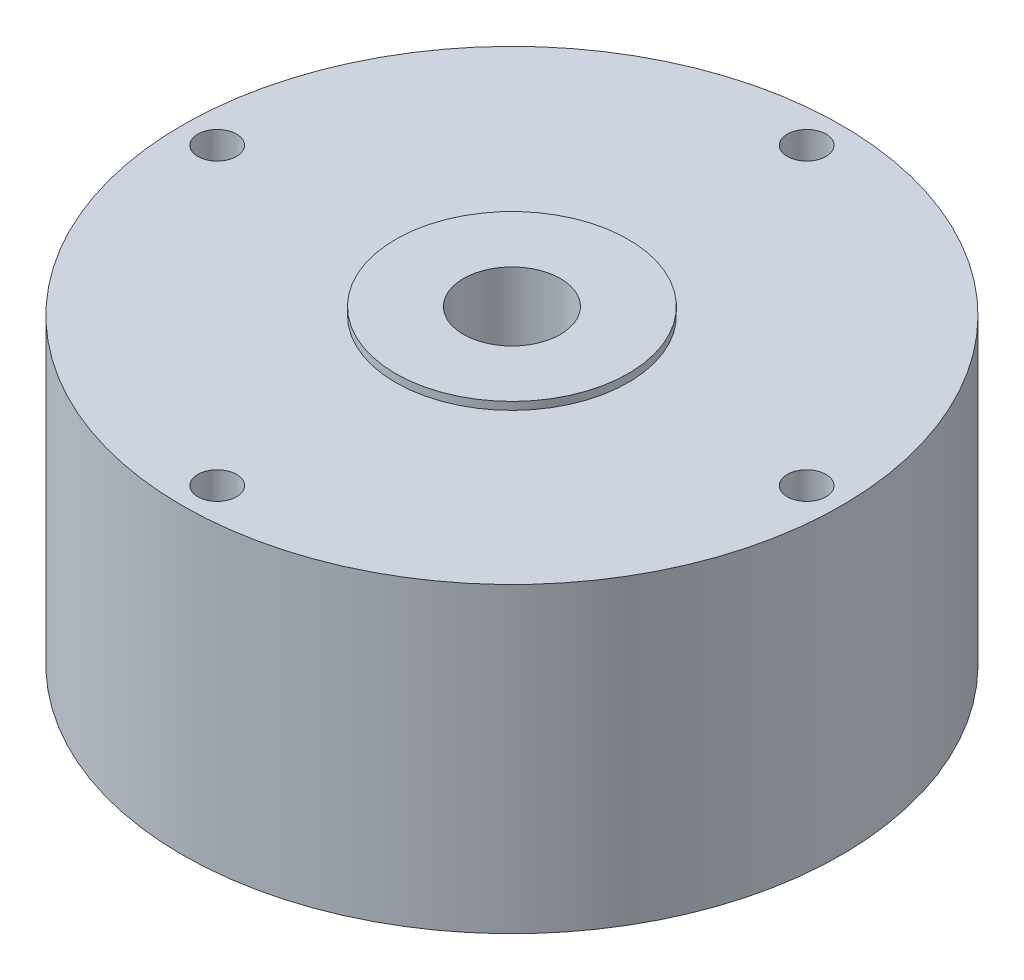
ISO-10303-21;
HEADER;
FILE_DESCRIPTION(('STEP AP214'),'2;1');
FILE_NAME('part.step','',(''),(''),'','','');
FILE_SCHEMA(('AUTOMOTIVE_DESIGN { 1 0 10303 214 1 1 1 1 }'));
ENDSEC;
DATA;
#1=APPLICATION_CONTEXT('core data for automotive mechanical design processes');
#2=APPLICATION_PROTOCOL_DEFINITION('international standard','automotive_design',2000,#1);
#3=PRODUCT_CONTEXT('',#1,'mechanical');
#4=PRODUCT('Part','Part','',(#3));
#5=PRODUCT_RELATED_PRODUCT_CATEGORY('part','',(#4));
#6=PRODUCT_DEFINITION_FORMATION('','',#4);
#7=PRODUCT_DEFINITION_CONTEXT('part definition',#1,'design');
#8=PRODUCT_DEFINITION('design','',#6,#7);
#9=PRODUCT_DEFINITION_SHAPE('','',#8);
#10=(LENGTH_UNIT() NAMED_UNIT(*) SI_UNIT(.MILLI.,.METRE.));
#11=(NAMED_UNIT(*) PLANE_ANGLE_UNIT() SI_UNIT($,.RADIAN.));
#12=(NAMED_UNIT(*) SI_UNIT($,.STERADIAN.) SOLID_ANGLE_UNIT());
#13=UNCERTAINTY_MEASURE_WITH_UNIT(LENGTH_MEASURE(1.E-05),#10,'distance_accuracy_value','');
#14=(GEOMETRIC_REPRESENTATION_CONTEXT(3) GLOBAL_UNCERTAINTY_ASSIGNED_CONTEXT((#13)) GLOBAL_UNIT_ASSIGNED_CONTEXT((#10,
#11,#12)) REPRESENTATION_CONTEXT('',''));
#15=CARTESIAN_POINT('',(0.,0.,0.));
#16=DIRECTION('',(0.,0.,1.));
#17=DIRECTION('',(1.,0.,0.));
#18=AXIS2_PLACEMENT_3D('',#15,#16,#17);
#19=CARTESIAN_POINT('',(0.,16.,0.));
#20=DIRECTION('',(0.,-1.,0.));
#21=DIRECTION('',(0.,0.,-1.));
#22=AXIS2_PLACEMENT_3D('',#19,#20,#21);
#23=CYLINDRICAL_SURFACE('',#22,17.);
#24=CARTESIAN_POINT('',(0.,0.,0.));
#25=DIRECTION('',(0.,1.,0.));
#26=DIRECTION('',(0.,0.,1.));
#27=AXIS2_PLACEMENT_3D('',#24,#25,#26);
#28=CIRCLE('',#27,17.);
#29=CARTESIAN_POINT('',(0.,0.,17.));
#30=VERTEX_POINT('',#29);
#31=EDGE_CURVE('E10',#30,#30,#28,.T.);
#32=ORIENTED_EDGE('',*,*,#31,.T.);
#33=EDGE_LOOP('',(#32));
#34=FACE_BOUND('',#33,.T.);
#35=CARTESIAN_POINT('',(0.,15.6,0.));
#36=DIRECTION('',(0.,1.,0.));
#37=DIRECTION('',(0.,0.,1.));
#38=AXIS2_PLACEMENT_3D('',#35,#36,#37);
#39=CIRCLE('',#38,17.);
#40=CARTESIAN_POINT('',(0.,15.6,17.));
#41=VERTEX_POINT('',#40);
#42=EDGE_CURVE('E40',#41,#41,#39,.T.);
#43=ORIENTED_EDGE('',*,*,#42,.F.);
#44=EDGE_LOOP('',(#43));
#45=FACE_BOUND('',#44,.T.);
#46=ADVANCED_FACE('F33',(#34,#45),#23,.T.);
#47=CARTESIAN_POINT('',(0.,0.,0.));
#48=DIRECTION('',(0.,1.,0.));
#49=DIRECTION('',(0.,0.,1.));
#50=AXIS2_PLACEMENT_3D('',#47,#48,#49);
#51=PLANE('',#50);
#52=CARTESIAN_POINT('',(0.,0.,0.));
#53=DIRECTION('',(0.,-1.,0.));
#54=DIRECTION('',(0.,0.,-1.));
#55=AXIS2_PLACEMENT_3D('',#52,#53,#54);
#56=CIRCLE('',#55,2.5);
#57=CARTESIAN_POINT('',(0.,0.,-2.5));
#58=VERTEX_POINT('',#57);
#59=EDGE_CURVE('E105',#58,#58,#56,.T.);
#60=ORIENTED_EDGE('',*,*,#59,.F.);
#61=EDGE_LOOP('',(#60));
#62=FACE_BOUND('',#61,.T.);
#63=CARTESIAN_POINT('',(-11.,0.,-6.));
#64=DIRECTION('',(0.,-1.,0.));
#65=DIRECTION('',(0.,0.,-1.));
#66=AXIS2_PLACEMENT_3D('',#63,#64,#65);
#67=CIRCLE('',#66,1.25);
#68=CARTESIAN_POINT('',(-11.,0.,-7.25));
#69=VERTEX_POINT('',#68);
#70=EDGE_CURVE('E87',#69,#69,#67,.T.);
#71=ORIENTED_EDGE('',*,*,#70,.F.);
#72=EDGE_LOOP('',(#71));
#73=FACE_BOUND('',#72,.T.);
#74=CARTESIAN_POINT('',(11.,0.,-6.));
#75=DIRECTION('',(0.,-1.,0.));
#76=DIRECTION('',(0.,0.,-1.));
#77=AXIS2_PLACEMENT_3D('',#74,#75,#76);
#78=CIRCLE('',#77,1.25);
#79=CARTESIAN_POINT('',(11.,0.,-7.25));
#80=VERTEX_POINT('',#79);
#81=EDGE_CURVE('E94',#80,#80,#78,.T.);
#82=ORIENTED_EDGE('',*,*,#81,.F.);
#83=EDGE_LOOP('',(#82));
#84=FACE_BOUND('',#83,.T.);
#85=CARTESIAN_POINT('',(11.,0.,6.));
#86=DIRECTION('',(0.,-1.,0.));
#87=DIRECTION('',(0.,0.,-1.));
#88=AXIS2_PLACEMENT_3D('',#85,#86,#87);
#89=CIRCLE('',#88,1.25);
#90=CARTESIAN_POINT('',(11.,0.,4.75));
#91=VERTEX_POINT('',#90);
#92=EDGE_CURVE('E100',#91,#91,#89,.T.);
#93=ORIENTED_EDGE('',*,*,#92,.F.);
#94=EDGE_LOOP('',(#93));
#95=FACE_BOUND('',#94,.T.);
#96=CARTESIAN_POINT('',(-11.,0.,6.));
#97=DIRECTION('',(0.,-1.,0.));
#98=DIRECTION('',(0.,0.,-1.));
#99=AXIS2_PLACEMENT_3D('',#96,#97,#98);
#100=CIRCLE('',#99,1.25);
#101=CARTESIAN_POINT('',(-11.,0.,4.75));
#102=VERTEX_POINT('',#101);
#103=EDGE_CURVE('E81',#102,#102,#100,.T.);
#104=ORIENTED_EDGE('',*,*,#103,.F.);
#105=EDGE_LOOP('',(#104));
#106=FACE_BOUND('',#105,.T.);
#107=ORIENTED_EDGE('',*,*,#31,.F.);
#108=EDGE_LOOP('',(#107));
#109=FACE_BOUND('',#108,.T.);
#110=ADVANCED_FACE('F120',(#62,#73,#84,#95,#106,#109),#51,.F.);
#111=CARTESIAN_POINT('',(0.,15.6,0.));
#112=DIRECTION('',(0.,1.,0.));
#113=DIRECTION('',(0.,0.,1.));
#114=AXIS2_PLACEMENT_3D('',#111,#112,#113);
#115=PLANE('',#114);
#116=CARTESIAN_POINT('',(0.,15.6,-15.2028));
#117=DIRECTION('',(0.,1.,0.));
#118=DIRECTION('',(0.,0.,1.));
#119=AXIS2_PLACEMENT_3D('',#116,#117,#118);
#120=CIRCLE('',#119,1.);
#121=CARTESIAN_POINT('',(0.,15.6,-14.2028));
#122=VERTEX_POINT('',#121);
#123=EDGE_CURVE('E36',#122,#122,#120,.T.);
#124=ORIENTED_EDGE('',*,*,#123,.F.);
#125=EDGE_LOOP('',(#124));
#126=FACE_BOUND('',#125,.T.);
#127=CARTESIAN_POINT('',(15.2028,15.6,0.));
#128=DIRECTION('',(0.,1.,0.));
#129=DIRECTION('',(0.,0.,1.));
#130=AXIS2_PLACEMENT_3D('',#127,#128,#129);
#131=CIRCLE('',#130,1.);
#132=CARTESIAN_POINT('',(15.2028,15.6,1.));
#133=VERTEX_POINT('',#132);
#134=EDGE_CURVE('E55',#133,#133,#131,.T.);
#135=ORIENTED_EDGE('',*,*,#134,.F.);
#136=EDGE_LOOP('',(#135));
#137=FACE_BOUND('',#136,.T.);
#138=CARTESIAN_POINT('',(0.,15.6,15.2028));
#139=DIRECTION('',(0.,1.,0.));
#140=DIRECTION('',(0.,0.,1.));
#141=AXIS2_PLACEMENT_3D('',#138,#139,#140);
#142=CIRCLE('',#141,1.);
#143=CARTESIAN_POINT('',(0.,15.6,16.2028));
#144=VERTEX_POINT('',#143);
#145=EDGE_CURVE('E52',#144,#144,#142,.T.);
#146=ORIENTED_EDGE('',*,*,#145,.F.);
#147=EDGE_LOOP('',(#146));
#148=FACE_BOUND('',#147,.T.);
#149=CARTESIAN_POINT('',(-15.2028,15.6,0.));
#150=DIRECTION('',(0.,1.,0.));
#151=DIRECTION('',(0.,0.,1.));
#152=AXIS2_PLACEMENT_3D('',#149,#150,#151);
#153=CIRCLE('',#152,1.);
#154=CARTESIAN_POINT('',(-15.2028,15.6,1.));
#155=VERTEX_POINT('',#154);
#156=EDGE_CURVE('E49',#155,#155,#153,.T.);
#157=ORIENTED_EDGE('',*,*,#156,.F.);
#158=EDGE_LOOP('',(#157));
#159=FACE_BOUND('',#158,.T.);
#160=CARTESIAN_POINT('',(0.,15.6,0.));
#161=DIRECTION('',(0.,1.,0.));
#162=DIRECTION('',(0.,0.,1.));
#163=AXIS2_PLACEMENT_3D('',#160,#161,#162);
#164=CIRCLE('',#163,6.);
#165=CARTESIAN_POINT('',(0.,15.6,6.));
#166=VERTEX_POINT('',#165);
#167=EDGE_CURVE('E45',#166,#166,#164,.T.);
#168=ORIENTED_EDGE('',*,*,#167,.F.);
#169=EDGE_LOOP('',(#168));
#170=FACE_BOUND('',#169,.T.);
#171=ORIENTED_EDGE('',*,*,#42,.T.);
#172=EDGE_LOOP('',(#171));
#173=FACE_BOUND('',#172,.T.);
#174=ADVANCED_FACE('F123',(#126,#137,#148,#159,#170,#173),#115,.T.);
#175=CARTESIAN_POINT('',(0.,15.6,0.));
#176=DIRECTION('',(0.,1.,0.));
#177=DIRECTION('',(0.,0.,1.));
#178=AXIS2_PLACEMENT_3D('',#175,#176,#177);
#179=CYLINDRICAL_SURFACE('',#178,6.);
#180=ORIENTED_EDGE('',*,*,#167,.T.);
#181=EDGE_LOOP('',(#180));
#182=FACE_BOUND('',#181,.T.);
#183=CARTESIAN_POINT('',(0.,16.,0.));
#184=DIRECTION('',(0.,1.,0.));
#185=DIRECTION('',(0.,0.,1.));
#186=AXIS2_PLACEMENT_3D('',#183,#184,#185);
#187=CIRCLE('',#186,6.);
#188=CARTESIAN_POINT('',(0.,16.,6.));
#189=VERTEX_POINT('',#188);
#190=EDGE_CURVE('E60',#189,#189,#187,.T.);
#191=ORIENTED_EDGE('',*,*,#190,.F.);
#192=EDGE_LOOP('',(#191));
#193=FACE_BOUND('',#192,.T.);
#194=ADVANCED_FACE('F157',(#182,#193),#179,.T.);
#195=CARTESIAN_POINT('',(0.,16.,0.));
#196=DIRECTION('',(0.,1.,0.));
#197=DIRECTION('',(0.,0.,1.));
#198=AXIS2_PLACEMENT_3D('',#195,#196,#197);
#199=PLANE('',#198);
#200=CARTESIAN_POINT('',(0.,16.,0.));
#201=DIRECTION('',(0.,-1.,0.));
#202=DIRECTION('',(0.,0.,-1.));
#203=AXIS2_PLACEMENT_3D('',#200,#201,#202);
#204=CIRCLE('',#203,2.5);
#205=CARTESIAN_POINT('',(0.,16.,-2.5));
#206=VERTEX_POINT('',#205);
#207=EDGE_CURVE('E91',#206,#206,#204,.T.);
#208=ORIENTED_EDGE('',*,*,#207,.T.);
#209=EDGE_LOOP('',(#208));
#210=FACE_BOUND('',#209,.T.);
#211=ORIENTED_EDGE('',*,*,#190,.T.);
#212=EDGE_LOOP('',(#211));
#213=FACE_BOUND('',#212,.T.);
#214=ADVANCED_FACE('F111',(#210,#213),#199,.T.);
#215=CARTESIAN_POINT('',(-15.2028,12.6,0.));
#216=DIRECTION('',(0.,1.,0.));
#217=DIRECTION('',(0.,0.,1.));
#218=AXIS2_PLACEMENT_3D('',#215,#216,#217);
#219=CYLINDRICAL_SURFACE('',#218,1.);
#220=ORIENTED_EDGE('',*,*,#156,.T.);
#221=EDGE_LOOP('',(#220));
#222=FACE_BOUND('',#221,.T.);
#223=CARTESIAN_POINT('',(-15.2028,12.6,0.));
#224=DIRECTION('',(0.,1.,0.));
#225=DIRECTION('',(0.,0.,1.));
#226=AXIS2_PLACEMENT_3D('',#223,#224,#225);
#227=CIRCLE('',#226,1.);
#228=CARTESIAN_POINT('',(-15.2028,12.6,1.));
#229=VERTEX_POINT('',#228);
#230=EDGE_CURVE('E69',#229,#229,#227,.T.);
#231=ORIENTED_EDGE('',*,*,#230,.F.);
#232=EDGE_LOOP('',(#231));
#233=FACE_BOUND('',#232,.T.);
#234=ADVANCED_FACE('F169',(#222,#233),#219,.F.);
#235=CARTESIAN_POINT('',(-15.2028,12.6,0.));
#236=DIRECTION('',(0.,1.,0.));
#237=DIRECTION('',(0.,0.,1.));
#238=AXIS2_PLACEMENT_3D('',#235,#236,#237);
#239=PLANE('',#238);
#240=ORIENTED_EDGE('',*,*,#230,.T.);
#241=EDGE_LOOP('',(#240));
#242=FACE_BOUND('',#241,.T.);
#243=ADVANCED_FACE('F173',(#242),#239,.T.);
#244=CARTESIAN_POINT('',(0.,12.6,15.2028));
#245=DIRECTION('',(0.,1.,0.));
#246=DIRECTION('',(0.,0.,1.));
#247=AXIS2_PLACEMENT_3D('',#244,#245,#246);
#248=CYLINDRICAL_SURFACE('',#247,1.);
#249=ORIENTED_EDGE('',*,*,#145,.T.);
#250=EDGE_LOOP('',(#249));
#251=FACE_BOUND('',#250,.T.);
#252=CARTESIAN_POINT('',(0.,12.6,15.2028));
#253=DIRECTION('',(0.,1.,0.));
#254=DIRECTION('',(0.,0.,1.));
#255=AXIS2_PLACEMENT_3D('',#252,#253,#254);
#256=CIRCLE('',#255,1.);
#257=CARTESIAN_POINT('',(0.,12.6,16.2028));
#258=VERTEX_POINT('',#257);
#259=EDGE_CURVE('E72',#258,#258,#256,.T.);
#260=ORIENTED_EDGE('',*,*,#259,.F.);
#261=EDGE_LOOP('',(#260));
#262=FACE_BOUND('',#261,.T.);
#263=ADVANCED_FACE('F178',(#251,#262),#248,.F.);
#264=CARTESIAN_POINT('',(0.,12.6,15.2028));
#265=DIRECTION('',(0.,1.,0.));
#266=DIRECTION('',(0.,0.,1.));
#267=AXIS2_PLACEMENT_3D('',#264,#265,#266);
#268=PLANE('',#267);
#269=ORIENTED_EDGE('',*,*,#259,.T.);
#270=EDGE_LOOP('',(#269));
#271=FACE_BOUND('',#270,.T.);
#272=ADVANCED_FACE('F185',(#271),#268,.T.);
#273=CARTESIAN_POINT('',(15.2028,12.6,0.));
#274=DIRECTION('',(0.,1.,0.));
#275=DIRECTION('',(0.,0.,1.));
#276=AXIS2_PLACEMENT_3D('',#273,#274,#275);
#277=CYLINDRICAL_SURFACE('',#276,1.);
#278=ORIENTED_EDGE('',*,*,#134,.T.);
#279=EDGE_LOOP('',(#278));
#280=FACE_BOUND('',#279,.T.);
#281=CARTESIAN_POINT('',(15.2028,12.6,0.));
#282=DIRECTION('',(0.,1.,0.));
#283=DIRECTION('',(0.,0.,1.));
#284=AXIS2_PLACEMENT_3D('',#281,#282,#283);
#285=CIRCLE('',#284,1.);
#286=CARTESIAN_POINT('',(15.2028,12.6,1.));
#287=VERTEX_POINT('',#286);
#288=EDGE_CURVE('E76',#287,#287,#285,.T.);
#289=ORIENTED_EDGE('',*,*,#288,.F.);
#290=EDGE_LOOP('',(#289));
#291=FACE_BOUND('',#290,.T.);
#292=ADVANCED_FACE('F189',(#280,#291),#277,.F.);
#293=CARTESIAN_POINT('',(15.2028,12.6,0.));
#294=DIRECTION('',(0.,1.,0.));
#295=DIRECTION('',(0.,0.,1.));
#296=AXIS2_PLACEMENT_3D('',#293,#294,#295);
#297=PLANE('',#296);
#298=ORIENTED_EDGE('',*,*,#288,.T.);
#299=EDGE_LOOP('',(#298));
#300=FACE_BOUND('',#299,.T.);
#301=ADVANCED_FACE('F193',(#300),#297,.T.);
#302=CARTESIAN_POINT('',(0.,12.6,-15.2028));
#303=DIRECTION('',(0.,1.,0.));
#304=DIRECTION('',(0.,0.,1.));
#305=AXIS2_PLACEMENT_3D('',#302,#303,#304);
#306=CYLINDRICAL_SURFACE('',#305,1.);
#307=ORIENTED_EDGE('',*,*,#123,.T.);
#308=EDGE_LOOP('',(#307));
#309=FACE_BOUND('',#308,.T.);
#310=CARTESIAN_POINT('',(0.,12.6,-15.2028));
#311=DIRECTION('',(0.,1.,0.));
#312=DIRECTION('',(0.,0.,1.));
#313=AXIS2_PLACEMENT_3D('',#310,#311,#312);
#314=CIRCLE('',#313,1.);
#315=CARTESIAN_POINT('',(0.,12.6,-14.2028));
#316=VERTEX_POINT('',#315);
#317=EDGE_CURVE('E53',#316,#316,#314,.T.);
#318=ORIENTED_EDGE('',*,*,#317,.F.);
#319=EDGE_LOOP('',(#318));
#320=FACE_BOUND('',#319,.T.);
#321=ADVANCED_FACE('F146',(#309,#320),#306,.F.);
#322=CARTESIAN_POINT('',(0.,12.6,-15.2028));
#323=DIRECTION('',(0.,1.,0.));
#324=DIRECTION('',(0.,0.,1.));
#325=AXIS2_PLACEMENT_3D('',#322,#323,#324);
#326=PLANE('',#325);
#327=ORIENTED_EDGE('',*,*,#317,.T.);
#328=EDGE_LOOP('',(#327));
#329=FACE_BOUND('',#328,.T.);
#330=ADVANCED_FACE('F136',(#329),#326,.T.);
#331=CARTESIAN_POINT('',(-11.,3.,6.));
#332=DIRECTION('',(0.,-1.,0.));
#333=DIRECTION('',(0.,0.,-1.));
#334=AXIS2_PLACEMENT_3D('',#331,#332,#333);
#335=CYLINDRICAL_SURFACE('',#334,1.25);
#336=CARTESIAN_POINT('',(-11.,3.,6.));
#337=DIRECTION('',(0.,-1.,0.));
#338=DIRECTION('',(0.,0.,-1.));
#339=AXIS2_PLACEMENT_3D('',#336,#337,#338);
#340=CIRCLE('',#339,1.25);
#341=CARTESIAN_POINT('',(-11.,3.,4.75));
#342=VERTEX_POINT('',#341);
#343=EDGE_CURVE('E73',#342,#342,#340,.T.);
#344=ORIENTED_EDGE('',*,*,#343,.F.);
#345=EDGE_LOOP('',(#344));
#346=FACE_BOUND('',#345,.T.);
#347=ORIENTED_EDGE('',*,*,#103,.T.);
#348=EDGE_LOOP('',(#347));
#349=FACE_BOUND('',#348,.T.);
#350=ADVANCED_FACE('F133',(#346,#349),#335,.F.);
#351=CARTESIAN_POINT('',(-11.,3.,6.));
#352=DIRECTION('',(0.,-1.,0.));
#353=DIRECTION('',(0.,0.,-1.));
#354=AXIS2_PLACEMENT_3D('',#351,#352,#353);
#355=PLANE('',#354);
#356=ORIENTED_EDGE('',*,*,#343,.T.);
#357=EDGE_LOOP('',(#356));
#358=FACE_BOUND('',#357,.T.);
#359=ADVANCED_FACE('F135',(#358),#355,.T.);
#360=CARTESIAN_POINT('',(11.,3.,6.));
#361=DIRECTION('',(0.,-1.,0.));
#362=DIRECTION('',(0.,0.,-1.));
#363=AXIS2_PLACEMENT_3D('',#360,#361,#362);
#364=CYLINDRICAL_SURFACE('',#363,1.25);
#365=CARTESIAN_POINT('',(11.,3.,6.));
#366=DIRECTION('',(0.,-1.,0.));
#367=DIRECTION('',(0.,0.,-1.));
#368=AXIS2_PLACEMENT_3D('',#365,#366,#367);
#369=CIRCLE('',#368,1.25);
#370=CARTESIAN_POINT('',(11.,3.,4.75));
#371=VERTEX_POINT('',#370);
#372=EDGE_CURVE('E84',#371,#371,#369,.T.);
#373=ORIENTED_EDGE('',*,*,#372,.F.);
#374=EDGE_LOOP('',(#373));
#375=FACE_BOUND('',#374,.T.);
#376=ORIENTED_EDGE('',*,*,#92,.T.);
#377=EDGE_LOOP('',(#376));
#378=FACE_BOUND('',#377,.T.);
#379=ADVANCED_FACE('F143',(#375,#378),#364,.F.);
#380=CARTESIAN_POINT('',(11.,3.,6.));
#381=DIRECTION('',(0.,-1.,0.));
#382=DIRECTION('',(0.,0.,-1.));
#383=AXIS2_PLACEMENT_3D('',#380,#381,#382);
#384=PLANE('',#383);
#385=ORIENTED_EDGE('',*,*,#372,.T.);
#386=EDGE_LOOP('',(#385));
#387=FACE_BOUND('',#386,.T.);
#388=ADVANCED_FACE('F227',(#387),#384,.T.);
#389=CARTESIAN_POINT('',(11.,3.,-6.));
#390=DIRECTION('',(0.,-1.,0.));
#391=DIRECTION('',(0.,0.,-1.));
#392=AXIS2_PLACEMENT_3D('',#389,#390,#391);
#393=CYLINDRICAL_SURFACE('',#392,1.25);
#394=CARTESIAN_POINT('',(11.,3.,-6.));
#395=DIRECTION('',(0.,-1.,0.));
#396=DIRECTION('',(0.,0.,-1.));
#397=AXIS2_PLACEMENT_3D('',#394,#395,#396);
#398=CIRCLE('',#397,1.25);
#399=CARTESIAN_POINT('',(11.,3.,-7.25));
#400=VERTEX_POINT('',#399);
#401=EDGE_CURVE('E97',#400,#400,#398,.T.);
#402=ORIENTED_EDGE('',*,*,#401,.F.);
#403=EDGE_LOOP('',(#402));
#404=FACE_BOUND('',#403,.T.);
#405=ORIENTED_EDGE('',*,*,#81,.T.);
#406=EDGE_LOOP('',(#405));
#407=FACE_BOUND('',#406,.T.);
#408=ADVANCED_FACE('F237',(#404,#407),#393,.F.);
#409=CARTESIAN_POINT('',(11.,3.,-6.));
#410=DIRECTION('',(0.,-1.,0.));
#411=DIRECTION('',(0.,0.,-1.));
#412=AXIS2_PLACEMENT_3D('',#409,#410,#411);
#413=PLANE('',#412);
#414=ORIENTED_EDGE('',*,*,#401,.T.);
#415=EDGE_LOOP('',(#414));
#416=FACE_BOUND('',#415,.T.);
#417=ADVANCED_FACE('F247',(#416),#413,.T.);
#418=CARTESIAN_POINT('',(-11.,3.,-6.));
#419=DIRECTION('',(0.,-1.,0.));
#420=DIRECTION('',(0.,0.,-1.));
#421=AXIS2_PLACEMENT_3D('',#418,#419,#420);
#422=CYLINDRICAL_SURFACE('',#421,1.25);
#423=CARTESIAN_POINT('',(-11.,3.,-6.));
#424=DIRECTION('',(0.,-1.,0.));
#425=DIRECTION('',(0.,0.,-1.));
#426=AXIS2_PLACEMENT_3D('',#423,#424,#425);
#427=CIRCLE('',#426,1.25);
#428=CARTESIAN_POINT('',(-11.,3.,-7.25));
#429=VERTEX_POINT('',#428);
#430=EDGE_CURVE('E90',#429,#429,#427,.T.);
#431=ORIENTED_EDGE('',*,*,#430,.F.);
#432=EDGE_LOOP('',(#431));
#433=FACE_BOUND('',#432,.T.);
#434=ORIENTED_EDGE('',*,*,#70,.T.);
#435=EDGE_LOOP('',(#434));
#436=FACE_BOUND('',#435,.T.);
#437=ADVANCED_FACE('F257',(#433,#436),#422,.F.);
#438=CARTESIAN_POINT('',(-11.,3.,-6.));
#439=DIRECTION('',(0.,-1.,0.));
#440=DIRECTION('',(0.,0.,-1.));
#441=AXIS2_PLACEMENT_3D('',#438,#439,#440);
#442=PLANE('',#441);
#443=ORIENTED_EDGE('',*,*,#430,.T.);
#444=EDGE_LOOP('',(#443));
#445=FACE_BOUND('',#444,.T.);
#446=ADVANCED_FACE('F116',(#445),#442,.T.);
#447=CARTESIAN_POINT('',(0.,16.,0.));
#448=DIRECTION('',(0.,-1.,0.));
#449=DIRECTION('',(0.,0.,-1.));
#450=AXIS2_PLACEMENT_3D('',#447,#448,#449);
#451=CYLINDRICAL_SURFACE('',#450,2.5);
#452=ORIENTED_EDGE('',*,*,#207,.F.);
#453=EDGE_LOOP('',(#452));
#454=FACE_BOUND('',#453,.T.);
#455=ORIENTED_EDGE('',*,*,#59,.T.);
#456=EDGE_LOOP('',(#455));
#457=FACE_BOUND('',#456,.T.);
#458=ADVANCED_FACE('F113',(#454,#457),#451,.F.);
#459=CLOSED_SHELL('',(#46,#110,#174,#194,#214,#234,#243,#263,#272,#292,#301,#321,#330,#350,#359,
#379,#388,#408,#417,#437,#446,#458));
#460=MANIFOLD_SOLID_BREP('B2',#459);
#461=ADVANCED_BREP_SHAPE_REPRESENTATION('',(#18,#460),#14);
#462=SHAPE_DEFINITION_REPRESENTATION(#9,#461);
ENDSEC;
END-ISO-10303-21;
